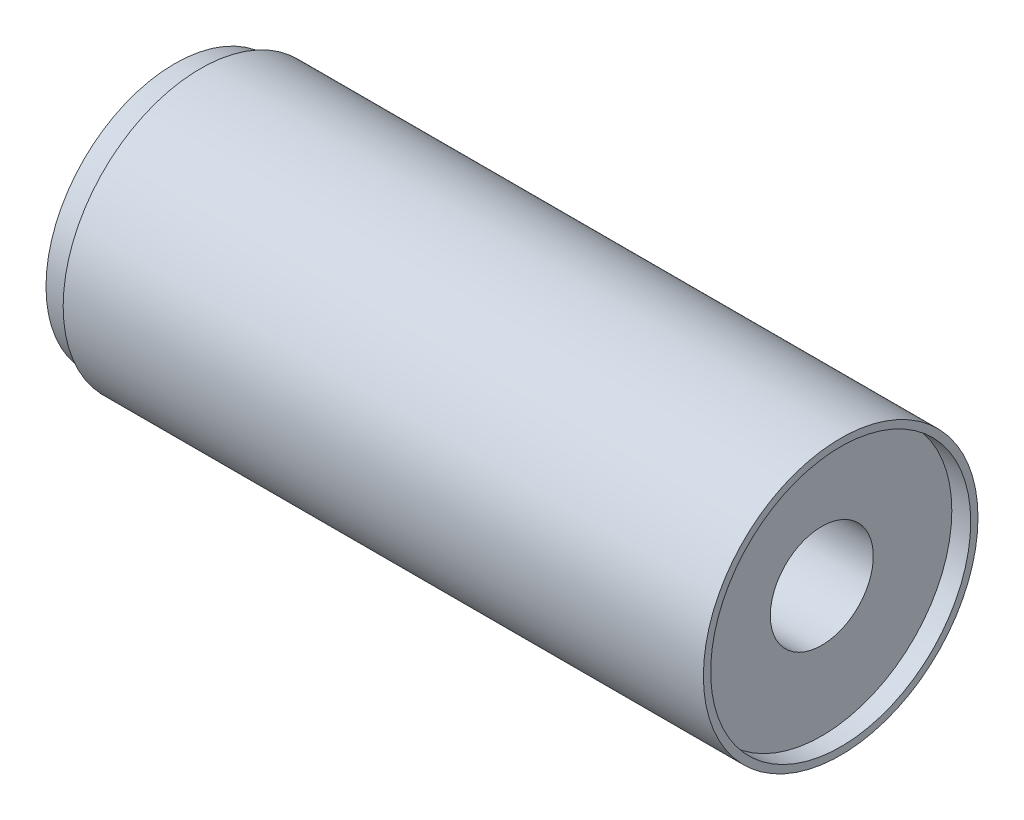
ISO-10303-21;
HEADER;
FILE_DESCRIPTION(('STEP AP214'),'2;1');
FILE_NAME('part.step','',(''),(''),'','','');
FILE_SCHEMA(('AUTOMOTIVE_DESIGN { 1 0 10303 214 1 1 1 1 }'));
ENDSEC;
DATA;
#1=APPLICATION_CONTEXT('core data for automotive mechanical design processes');
#2=APPLICATION_PROTOCOL_DEFINITION('international standard','automotive_design',2000,#1);
#3=PRODUCT_CONTEXT('',#1,'mechanical');
#4=PRODUCT('Part','Part','',(#3));
#5=PRODUCT_RELATED_PRODUCT_CATEGORY('part','',(#4));
#6=PRODUCT_DEFINITION_FORMATION('','',#4);
#7=PRODUCT_DEFINITION_CONTEXT('part definition',#1,'design');
#8=PRODUCT_DEFINITION('design','',#6,#7);
#9=PRODUCT_DEFINITION_SHAPE('','',#8);
#10=(LENGTH_UNIT() NAMED_UNIT(*) SI_UNIT(.MILLI.,.METRE.));
#11=(NAMED_UNIT(*) PLANE_ANGLE_UNIT() SI_UNIT($,.RADIAN.));
#12=(NAMED_UNIT(*) SI_UNIT($,.STERADIAN.) SOLID_ANGLE_UNIT());
#13=UNCERTAINTY_MEASURE_WITH_UNIT(LENGTH_MEASURE(1.E-05),#10,'distance_accuracy_value','');
#14=(GEOMETRIC_REPRESENTATION_CONTEXT(3) GLOBAL_UNCERTAINTY_ASSIGNED_CONTEXT((#13)) GLOBAL_UNIT_ASSIGNED_CONTEXT((#10,
#11,#12)) REPRESENTATION_CONTEXT('',''));
#15=CARTESIAN_POINT('',(0.,0.,0.));
#16=DIRECTION('',(0.,0.,1.));
#17=DIRECTION('',(1.,0.,0.));
#18=AXIS2_PLACEMENT_3D('',#15,#16,#17);
#19=CARTESIAN_POINT('',(19.9,0.,3.25));
#20=DIRECTION('',(-1.,0.,0.));
#21=DIRECTION('',(0.,0.,1.));
#22=AXIS2_PLACEMENT_3D('',#19,#20,#21);
#23=PLANE('',#22);
#24=CARTESIAN_POINT('',(19.9,0.,0.));
#25=DIRECTION('',(1.,0.,0.));
#26=DIRECTION('',(0.,0.,-1.));
#27=AXIS2_PLACEMENT_3D('',#24,#25,#26);
#28=CIRCLE('',#27,3.5);
#29=CARTESIAN_POINT('',(19.9,0.,-3.5));
#30=VERTEX_POINT('',#29);
#31=EDGE_CURVE('E17',#30,#30,#28,.T.);
#32=ORIENTED_EDGE('',*,*,#31,.F.);
#33=EDGE_LOOP('',(#32));
#34=FACE_BOUND('',#33,.T.);
#35=CARTESIAN_POINT('',(19.9,0.,0.));
#36=DIRECTION('',(-1.,0.,0.));
#37=DIRECTION('',(0.,0.,1.));
#38=AXIS2_PLACEMENT_3D('',#35,#36,#37);
#39=CIRCLE('',#38,3.);
#40=CARTESIAN_POINT('',(19.9,0.,3.));
#41=VERTEX_POINT('',#40);
#42=EDGE_CURVE('E45',#41,#41,#39,.F.);
#43=ORIENTED_EDGE('',*,*,#42,.T.);
#44=EDGE_LOOP('',(#43));
#45=FACE_BOUND('',#44,.T.);
#46=ADVANCED_FACE('F14',(#34,#45),#23,.T.);
#47=CARTESIAN_POINT('',(20.3,0.,0.));
#48=DIRECTION('',(1.,0.,0.));
#49=DIRECTION('',(0.,0.,-1.));
#50=AXIS2_PLACEMENT_3D('',#47,#48,#49);
#51=CYLINDRICAL_SURFACE('',#50,3.5);
#52=CARTESIAN_POINT('',(20.7,0.,0.));
#53=DIRECTION('',(1.,0.,0.));
#54=DIRECTION('',(0.,0.,-1.));
#55=AXIS2_PLACEMENT_3D('',#52,#53,#54);
#56=CIRCLE('',#55,3.5);
#57=CARTESIAN_POINT('',(20.7,0.,-3.5));
#58=VERTEX_POINT('',#57);
#59=EDGE_CURVE('E43',#58,#58,#56,.T.);
#60=ORIENTED_EDGE('',*,*,#59,.F.);
#61=EDGE_LOOP('',(#60));
#62=FACE_BOUND('',#61,.T.);
#63=ORIENTED_EDGE('',*,*,#31,.T.);
#64=EDGE_LOOP('',(#63));
#65=FACE_BOUND('',#64,.T.);
#66=ADVANCED_FACE('F52',(#62,#65),#51,.T.);
#67=CARTESIAN_POINT('',(40.1,0.,0.));
#68=DIRECTION('',(-1.,0.,0.));
#69=DIRECTION('',(0.,0.,1.));
#70=AXIS2_PLACEMENT_3D('',#67,#68,#69);
#71=CYLINDRICAL_SURFACE('',#70,3.);
#72=ORIENTED_EDGE('',*,*,#42,.F.);
#73=EDGE_LOOP('',(#72));
#74=FACE_BOUND('',#73,.T.);
#75=CARTESIAN_POINT('',(58.4,0.,0.));
#76=DIRECTION('',(-1.,0.,0.));
#77=DIRECTION('',(0.,0.,1.));
#78=AXIS2_PLACEMENT_3D('',#75,#76,#77);
#79=CIRCLE('',#78,3.);
#80=CARTESIAN_POINT('',(58.4,0.,3.));
#81=VERTEX_POINT('',#80);
#82=EDGE_CURVE('E40',#81,#81,#79,.F.);
#83=ORIENTED_EDGE('',*,*,#82,.T.);
#84=EDGE_LOOP('',(#83));
#85=FACE_BOUND('',#84,.T.);
#86=ADVANCED_FACE('F59',(#74,#85),#71,.F.);
#87=CARTESIAN_POINT('',(20.7,0.,5.25));
#88=DIRECTION('',(-1.,0.,0.));
#89=DIRECTION('',(0.,0.,1.));
#90=AXIS2_PLACEMENT_3D('',#87,#88,#89);
#91=PLANE('',#90);
#92=CARTESIAN_POINT('',(20.7,0.,0.));
#93=DIRECTION('',(-1.,0.,0.));
#94=DIRECTION('',(0.,0.,1.));
#95=AXIS2_PLACEMENT_3D('',#92,#93,#94);
#96=CIRCLE('',#95,7.5);
#97=CARTESIAN_POINT('',(20.7,0.,7.5));
#98=VERTEX_POINT('',#97);
#99=EDGE_CURVE('E37',#98,#98,#96,.F.);
#100=ORIENTED_EDGE('',*,*,#99,.F.);
#101=EDGE_LOOP('',(#100));
#102=FACE_BOUND('',#101,.T.);
#103=ORIENTED_EDGE('',*,*,#59,.T.);
#104=EDGE_LOOP('',(#103));
#105=FACE_BOUND('',#104,.T.);
#106=ADVANCED_FACE('F87',(#102,#105),#91,.T.);
#107=CARTESIAN_POINT('',(58.4,0.,0.));
#108=DIRECTION('',(-1.,0.,0.));
#109=DIRECTION('',(0.,0.,1.));
#110=AXIS2_PLACEMENT_3D('',#107,#108,#109);
#111=PLANE('',#110);
#112=CARTESIAN_POINT('',(58.4,0.,0.));
#113=DIRECTION('',(1.,0.,0.));
#114=DIRECTION('',(0.,0.,-1.));
#115=AXIS2_PLACEMENT_3D('',#112,#113,#114);
#116=CIRCLE('',#115,7.575);
#117=CARTESIAN_POINT('',(58.4,0.,-7.575));
#118=VERTEX_POINT('',#117);
#119=EDGE_CURVE('E34',#118,#118,#116,.T.);
#120=ORIENTED_EDGE('',*,*,#119,.T.);
#121=EDGE_LOOP('',(#120));
#122=FACE_BOUND('',#121,.T.);
#123=ORIENTED_EDGE('',*,*,#82,.F.);
#124=EDGE_LOOP('',(#123));
#125=FACE_BOUND('',#124,.T.);
#126=ADVANCED_FACE('F83',(#122,#125),#111,.F.);
#127=CARTESIAN_POINT('',(21.45,0.,0.));
#128=DIRECTION('',(-1.,0.,0.));
#129=DIRECTION('',(0.,0.,1.));
#130=AXIS2_PLACEMENT_3D('',#127,#128,#129);
#131=CYLINDRICAL_SURFACE('',#130,7.5);
#132=CARTESIAN_POINT('',(22.2,0.,0.));
#133=DIRECTION('',(-1.,0.,0.));
#134=DIRECTION('',(0.,0.,1.));
#135=AXIS2_PLACEMENT_3D('',#132,#133,#134);
#136=CIRCLE('',#135,7.5);
#137=CARTESIAN_POINT('',(22.2,0.,7.5));
#138=VERTEX_POINT('',#137);
#139=EDGE_CURVE('E31',#138,#138,#136,.F.);
#140=ORIENTED_EDGE('',*,*,#139,.F.);
#141=EDGE_LOOP('',(#140));
#142=FACE_BOUND('',#141,.T.);
#143=ORIENTED_EDGE('',*,*,#99,.T.);
#144=EDGE_LOOP('',(#143));
#145=FACE_BOUND('',#144,.T.);
#146=ADVANCED_FACE('F79',(#142,#145),#131,.T.);
#147=CARTESIAN_POINT('',(58.95,0.,0.));
#148=DIRECTION('',(1.,0.,0.));
#149=DIRECTION('',(0.,0.,-1.));
#150=AXIS2_PLACEMENT_3D('',#147,#148,#149);
#151=CYLINDRICAL_SURFACE('',#150,7.575);
#152=CARTESIAN_POINT('',(59.5,0.,0.));
#153=DIRECTION('',(1.,0.,0.));
#154=DIRECTION('',(0.,0.,-1.));
#155=AXIS2_PLACEMENT_3D('',#152,#153,#154);
#156=CIRCLE('',#155,7.575);
#157=CARTESIAN_POINT('',(59.5,0.,-7.575));
#158=VERTEX_POINT('',#157);
#159=EDGE_CURVE('E26',#158,#158,#156,.F.);
#160=ORIENTED_EDGE('',*,*,#159,.F.);
#161=EDGE_LOOP('',(#160));
#162=FACE_BOUND('',#161,.T.);
#163=ORIENTED_EDGE('',*,*,#119,.F.);
#164=EDGE_LOOP('',(#163));
#165=FACE_BOUND('',#164,.T.);
#166=ADVANCED_FACE('F75',(#162,#165),#151,.F.);
#167=CARTESIAN_POINT('',(22.2,0.,7.75));
#168=DIRECTION('',(-1.,0.,0.));
#169=DIRECTION('',(0.,0.,1.));
#170=AXIS2_PLACEMENT_3D('',#167,#168,#169);
#171=PLANE('',#170);
#172=ORIENTED_EDGE('',*,*,#139,.T.);
#173=EDGE_LOOP('',(#172));
#174=FACE_BOUND('',#173,.T.);
#175=CARTESIAN_POINT('',(22.2,0.,0.));
#176=DIRECTION('',(-1.,0.,0.));
#177=DIRECTION('',(0.,0.,1.));
#178=AXIS2_PLACEMENT_3D('',#175,#176,#177);
#179=CIRCLE('',#178,8.);
#180=CARTESIAN_POINT('',(22.2,0.,8.));
#181=VERTEX_POINT('',#180);
#182=EDGE_CURVE('E21',#181,#181,#179,.F.);
#183=ORIENTED_EDGE('',*,*,#182,.F.);
#184=EDGE_LOOP('',(#183));
#185=FACE_BOUND('',#184,.T.);
#186=ADVANCED_FACE('F69',(#174,#185),#171,.T.);
#187=CARTESIAN_POINT('',(59.5,0.,5.5));
#188=DIRECTION('',(1.,0.,0.));
#189=DIRECTION('',(0.,0.,-1.));
#190=AXIS2_PLACEMENT_3D('',#187,#188,#189);
#191=PLANE('',#190);
#192=CARTESIAN_POINT('',(59.5,0.,0.));
#193=DIRECTION('',(-1.,0.,0.));
#194=DIRECTION('',(0.,0.,1.));
#195=AXIS2_PLACEMENT_3D('',#192,#193,#194);
#196=CIRCLE('',#195,8.);
#197=CARTESIAN_POINT('',(59.5,0.,8.));
#198=VERTEX_POINT('',#197);
#199=EDGE_CURVE('E10',#198,#198,#196,.T.);
#200=ORIENTED_EDGE('',*,*,#199,.F.);
#201=EDGE_LOOP('',(#200));
#202=FACE_BOUND('',#201,.T.);
#203=ORIENTED_EDGE('',*,*,#159,.T.);
#204=EDGE_LOOP('',(#203));
#205=FACE_BOUND('',#204,.T.);
#206=ADVANCED_FACE('F63',(#202,#205),#191,.T.);
#207=CARTESIAN_POINT('',(40.85,0.,0.));
#208=DIRECTION('',(-1.,0.,0.));
#209=DIRECTION('',(0.,0.,1.));
#210=AXIS2_PLACEMENT_3D('',#207,#208,#209);
#211=CYLINDRICAL_SURFACE('',#210,8.);
#212=ORIENTED_EDGE('',*,*,#182,.T.);
#213=EDGE_LOOP('',(#212));
#214=FACE_BOUND('',#213,.T.);
#215=ORIENTED_EDGE('',*,*,#199,.T.);
#216=EDGE_LOOP('',(#215));
#217=FACE_BOUND('',#216,.T.);
#218=ADVANCED_FACE('F61',(#214,#217),#211,.T.);
#219=CLOSED_SHELL('',(#46,#66,#86,#106,#126,#146,#166,#186,#206,#218));
#220=MANIFOLD_SOLID_BREP('B1',#219);
#221=ADVANCED_BREP_SHAPE_REPRESENTATION('',(#18,#220),#14);
#222=SHAPE_DEFINITION_REPRESENTATION(#9,#221);
ENDSEC;
END-ISO-10303-21;
